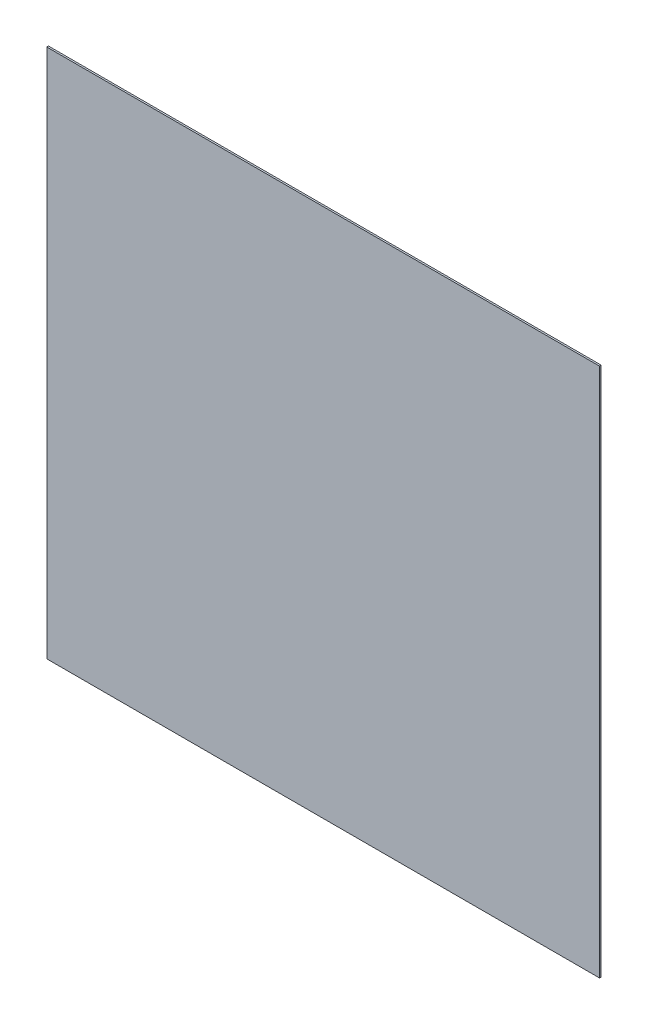
ISO-10303-21;
HEADER;
FILE_DESCRIPTION(('STEP AP214'),'2;1');
FILE_NAME('part.step','',(''),(''),'','','');
FILE_SCHEMA(('AUTOMOTIVE_DESIGN { 1 0 10303 214 1 1 1 1 }'));
ENDSEC;
DATA;
#1=APPLICATION_CONTEXT('core data for automotive mechanical design processes');
#2=APPLICATION_PROTOCOL_DEFINITION('international standard','automotive_design',2000,#1);
#3=PRODUCT_CONTEXT('',#1,'mechanical');
#4=PRODUCT('Part','Part','',(#3));
#5=PRODUCT_RELATED_PRODUCT_CATEGORY('part','',(#4));
#6=PRODUCT_DEFINITION_FORMATION('','',#4);
#7=PRODUCT_DEFINITION_CONTEXT('part definition',#1,'design');
#8=PRODUCT_DEFINITION('design','',#6,#7);
#9=PRODUCT_DEFINITION_SHAPE('','',#8);
#10=(LENGTH_UNIT() NAMED_UNIT(*) SI_UNIT(.MILLI.,.METRE.));
#11=(NAMED_UNIT(*) PLANE_ANGLE_UNIT() SI_UNIT($,.RADIAN.));
#12=(NAMED_UNIT(*) SI_UNIT($,.STERADIAN.) SOLID_ANGLE_UNIT());
#13=UNCERTAINTY_MEASURE_WITH_UNIT(LENGTH_MEASURE(1.E-05),#10,'distance_accuracy_value','');
#14=(GEOMETRIC_REPRESENTATION_CONTEXT(3) GLOBAL_UNCERTAINTY_ASSIGNED_CONTEXT((#13)) GLOBAL_UNIT_ASSIGNED_CONTEXT((#10,
#11,#12)) REPRESENTATION_CONTEXT('',''));
#15=CARTESIAN_POINT('',(0.,0.,0.));
#16=DIRECTION('',(0.,0.,1.));
#17=DIRECTION('',(1.,0.,0.));
#18=AXIS2_PLACEMENT_3D('',#15,#16,#17);
#19=CARTESIAN_POINT('',(-31.0658120015435,575.599139389822,-3.175));
#20=DIRECTION('',(0.,-1.,0.));
#21=DIRECTION('',(0.,0.,-1.));
#22=AXIS2_PLACEMENT_3D('',#19,#20,#21);
#23=PLANE('',#22);
#24=DIRECTION('',(1.,0.,0.));
#25=VECTOR('',#24,1.);
#26=CARTESIAN_POINT('',(-31.0658120015435,575.599139389822,0.));
#27=LINE('',#26,#25);
#28=CARTESIAN_POINT('',(-543.244709012781,575.599139389822,0.));
#29=VERTEX_POINT('',#28);
#30=CARTESIAN_POINT('',(481.113085009694,575.599139389822,0.));
#31=VERTEX_POINT('',#30);
#32=EDGE_CURVE('E80',#29,#31,#27,.T.);
#33=ORIENTED_EDGE('',*,*,#32,.T.);
#34=DIRECTION('',(0.,0.,1.));
#35=VECTOR('',#34,1.);
#36=CARTESIAN_POINT('',(481.113085009694,575.599139389822,-3.175));
#37=LINE('',#36,#35);
#38=CARTESIAN_POINT('',(481.113085009694,575.599139389822,-3.175));
#39=VERTEX_POINT('',#38);
#40=EDGE_CURVE('E33',#39,#31,#37,.T.);
#41=ORIENTED_EDGE('',*,*,#40,.F.);
#42=DIRECTION('',(1.,0.,0.));
#43=VECTOR('',#42,1.);
#44=CARTESIAN_POINT('',(-31.0658120015435,575.599139389822,-3.175));
#45=LINE('',#44,#43);
#46=CARTESIAN_POINT('',(-543.244709012781,575.599139389822,-3.175));
#47=VERTEX_POINT('',#46);
#48=EDGE_CURVE('E72',#47,#39,#45,.T.);
#49=ORIENTED_EDGE('',*,*,#48,.F.);
#50=DIRECTION('',(0.,0.,1.));
#51=VECTOR('',#50,1.);
#52=CARTESIAN_POINT('',(-543.244709012781,575.599139389822,-3.175));
#53=LINE('',#52,#51);
#54=EDGE_CURVE('E11',#47,#29,#53,.T.);
#55=ORIENTED_EDGE('',*,*,#54,.T.);
#56=EDGE_LOOP('',(#33,#41,#49,#55));
#57=FACE_BOUND('',#56,.T.);
#58=ADVANCED_FACE('F17',(#57),#23,.F.);
#59=CARTESIAN_POINT('',(-543.244709012781,84.6382213985881,-3.175));
#60=DIRECTION('',(-1.,0.,0.));
#61=DIRECTION('',(0.,0.,1.));
#62=AXIS2_PLACEMENT_3D('',#59,#60,#61);
#63=PLANE('',#62);
#64=DIRECTION('',(0.,-1.,0.));
#65=VECTOR('',#64,1.);
#66=CARTESIAN_POINT('',(-543.244709012781,84.6382213985881,0.));
#67=LINE('',#66,#65);
#68=CARTESIAN_POINT('',(-543.244709012781,-406.322696592645,0.));
#69=VERTEX_POINT('',#68);
#70=EDGE_CURVE('E82',#29,#69,#67,.T.);
#71=ORIENTED_EDGE('',*,*,#70,.F.);
#72=ORIENTED_EDGE('',*,*,#54,.F.);
#73=DIRECTION('',(0.,-1.,0.));
#74=VECTOR('',#73,1.);
#75=CARTESIAN_POINT('',(-543.244709012781,84.6382213985881,-3.175));
#76=LINE('',#75,#74);
#77=CARTESIAN_POINT('',(-543.244709012781,-406.322696592645,-3.175));
#78=VERTEX_POINT('',#77);
#79=EDGE_CURVE('E68',#47,#78,#76,.T.);
#80=ORIENTED_EDGE('',*,*,#79,.T.);
#81=DIRECTION('',(0.,0.,1.));
#82=VECTOR('',#81,1.);
#83=CARTESIAN_POINT('',(-543.244709012781,-406.322696592645,-3.175));
#84=LINE('',#83,#82);
#85=EDGE_CURVE('E25',#78,#69,#84,.T.);
#86=ORIENTED_EDGE('',*,*,#85,.T.);
#87=EDGE_LOOP('',(#71,#72,#80,#86));
#88=FACE_BOUND('',#87,.T.);
#89=ADVANCED_FACE('F69',(#88),#63,.T.);
#90=CARTESIAN_POINT('',(-31.0658120015433,-406.322696592645,-3.175));
#91=DIRECTION('',(0.,-1.,0.));
#92=DIRECTION('',(0.,0.,-1.));
#93=AXIS2_PLACEMENT_3D('',#90,#91,#92);
#94=PLANE('',#93);
#95=DIRECTION('',(1.,0.,0.));
#96=VECTOR('',#95,1.);
#97=CARTESIAN_POINT('',(-31.0658120015433,-406.322696592645,0.));
#98=LINE('',#97,#96);
#99=CARTESIAN_POINT('',(481.113085009694,-406.322696592645,0.));
#100=VERTEX_POINT('',#99);
#101=EDGE_CURVE('E66',#69,#100,#98,.T.);
#102=ORIENTED_EDGE('',*,*,#101,.F.);
#103=ORIENTED_EDGE('',*,*,#85,.F.);
#104=DIRECTION('',(1.,0.,0.));
#105=VECTOR('',#104,1.);
#106=CARTESIAN_POINT('',(-31.0658120015433,-406.322696592645,-3.175));
#107=LINE('',#106,#105);
#108=CARTESIAN_POINT('',(481.113085009694,-406.322696592645,-3.175));
#109=VERTEX_POINT('',#108);
#110=EDGE_CURVE('E63',#78,#109,#107,.T.);
#111=ORIENTED_EDGE('',*,*,#110,.T.);
#112=DIRECTION('',(0.,0.,1.));
#113=VECTOR('',#112,1.);
#114=CARTESIAN_POINT('',(481.113085009694,-406.322696592645,-3.175));
#115=LINE('',#114,#113);
#116=EDGE_CURVE('E49',#109,#100,#115,.T.);
#117=ORIENTED_EDGE('',*,*,#116,.T.);
#118=EDGE_LOOP('',(#102,#103,#111,#117));
#119=FACE_BOUND('',#118,.T.);
#120=ADVANCED_FACE('F61',(#119),#94,.T.);
#121=CARTESIAN_POINT('',(481.113085009694,84.6382213985881,-3.175));
#122=DIRECTION('',(-1.,0.,0.));
#123=DIRECTION('',(0.,-1.,0.));
#124=AXIS2_PLACEMENT_3D('',#121,#122,#123);
#125=PLANE('',#124);
#126=DIRECTION('',(0.,-1.,0.));
#127=VECTOR('',#126,1.);
#128=CARTESIAN_POINT('',(481.113085009694,84.6382213985881,0.));
#129=LINE('',#128,#127);
#130=EDGE_CURVE('E85',#31,#100,#129,.T.);
#131=ORIENTED_EDGE('',*,*,#130,.T.);
#132=ORIENTED_EDGE('',*,*,#116,.F.);
#133=DIRECTION('',(0.,-1.,0.));
#134=VECTOR('',#133,1.);
#135=CARTESIAN_POINT('',(481.113085009694,84.6382213985881,-3.175));
#136=LINE('',#135,#134);
#137=EDGE_CURVE('E75',#39,#109,#136,.T.);
#138=ORIENTED_EDGE('',*,*,#137,.F.);
#139=ORIENTED_EDGE('',*,*,#40,.T.);
#140=EDGE_LOOP('',(#131,#132,#138,#139));
#141=FACE_BOUND('',#140,.T.);
#142=ADVANCED_FACE('F97',(#141),#125,.F.);
#143=CARTESIAN_POINT('',(-31.0658120015433,84.6382213985881,-3.175));
#144=DIRECTION('',(0.,0.,1.));
#145=DIRECTION('',(1.,0.,0.));
#146=AXIS2_PLACEMENT_3D('',#143,#144,#145);
#147=PLANE('',#146);
#148=ORIENTED_EDGE('',*,*,#48,.T.);
#149=ORIENTED_EDGE('',*,*,#137,.T.);
#150=ORIENTED_EDGE('',*,*,#110,.F.);
#151=ORIENTED_EDGE('',*,*,#79,.F.);
#152=EDGE_LOOP('',(#148,#149,#150,#151));
#153=FACE_BOUND('',#152,.T.);
#154=ADVANCED_FACE('F74',(#153),#147,.F.);
#155=CARTESIAN_POINT('',(-31.0658120015433,84.6382213985881,0.));
#156=DIRECTION('',(0.,0.,1.));
#157=DIRECTION('',(1.,0.,0.));
#158=AXIS2_PLACEMENT_3D('',#155,#156,#157);
#159=PLANE('',#158);
#160=ORIENTED_EDGE('',*,*,#32,.F.);
#161=ORIENTED_EDGE('',*,*,#70,.T.);
#162=ORIENTED_EDGE('',*,*,#101,.T.);
#163=ORIENTED_EDGE('',*,*,#130,.F.);
#164=EDGE_LOOP('',(#160,#161,#162,#163));
#165=FACE_BOUND('',#164,.T.);
#166=ADVANCED_FACE('F90',(#165),#159,.T.);
#167=CLOSED_SHELL('',(#58,#89,#120,#142,#154,#166));
#168=MANIFOLD_SOLID_BREP('B1',#167);
#169=ADVANCED_BREP_SHAPE_REPRESENTATION('',(#18,#168),#14);
#170=SHAPE_DEFINITION_REPRESENTATION(#9,#169);
ENDSEC;
END-ISO-10303-21;
